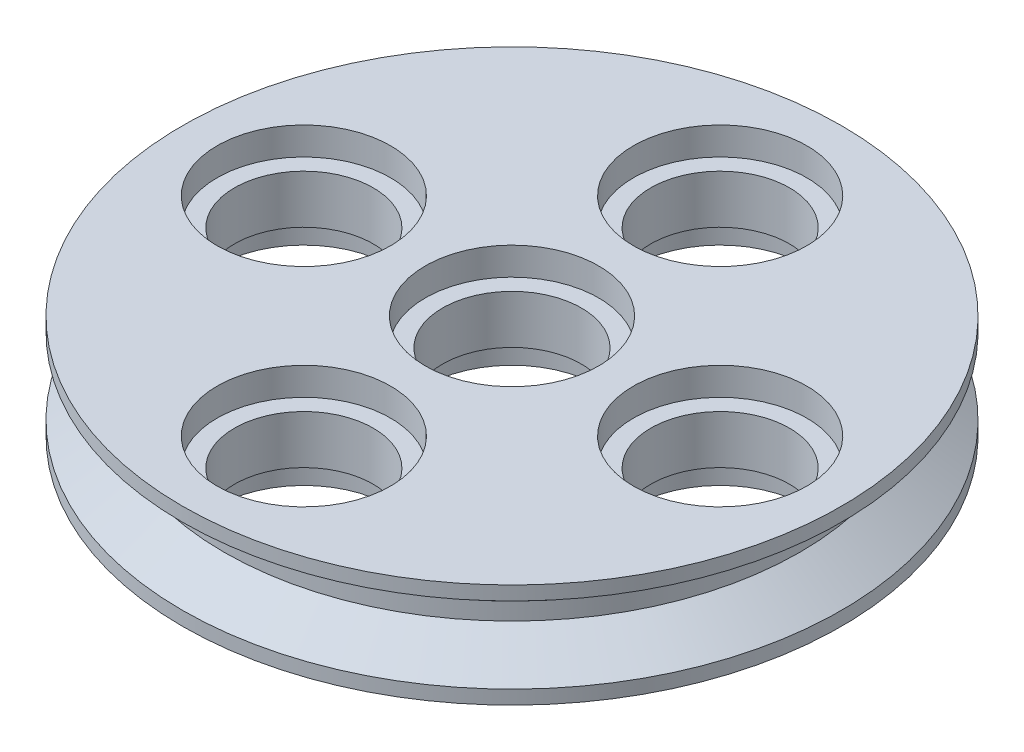
ISO-10303-21;
HEADER;
FILE_DESCRIPTION(('STEP AP214'),'2;1');
FILE_NAME('part.step','',(''),(''),'','','');
FILE_SCHEMA(('AUTOMOTIVE_DESIGN { 1 0 10303 214 1 1 1 1 }'));
ENDSEC;
DATA;
#1=APPLICATION_CONTEXT('core data for automotive mechanical design processes');
#2=APPLICATION_PROTOCOL_DEFINITION('international standard','automotive_design',2000,#1);
#3=PRODUCT_CONTEXT('',#1,'mechanical');
#4=PRODUCT('Part','Part','',(#3));
#5=PRODUCT_RELATED_PRODUCT_CATEGORY('part','',(#4));
#6=PRODUCT_DEFINITION_FORMATION('','',#4);
#7=PRODUCT_DEFINITION_CONTEXT('part definition',#1,'design');
#8=PRODUCT_DEFINITION('design','',#6,#7);
#9=PRODUCT_DEFINITION_SHAPE('','',#8);
#10=(LENGTH_UNIT() NAMED_UNIT(*) SI_UNIT(.MILLI.,.METRE.));
#11=(NAMED_UNIT(*) PLANE_ANGLE_UNIT() SI_UNIT($,.RADIAN.));
#12=(NAMED_UNIT(*) SI_UNIT($,.STERADIAN.) SOLID_ANGLE_UNIT());
#13=UNCERTAINTY_MEASURE_WITH_UNIT(LENGTH_MEASURE(1.E-05),#10,'distance_accuracy_value','');
#14=(GEOMETRIC_REPRESENTATION_CONTEXT(3) GLOBAL_UNCERTAINTY_ASSIGNED_CONTEXT((#13)) GLOBAL_UNIT_ASSIGNED_CONTEXT((#10,
#11,#12)) REPRESENTATION_CONTEXT('',''));
#15=CARTESIAN_POINT('',(0.,0.,0.));
#16=DIRECTION('',(0.,0.,1.));
#17=DIRECTION('',(1.,0.,0.));
#18=AXIS2_PLACEMENT_3D('',#15,#16,#17);
#19=CARTESIAN_POINT('',(0.,1.5,0.));
#20=DIRECTION('',(0.,-1.,0.));
#21=DIRECTION('',(0.,0.,-1.));
#22=AXIS2_PLACEMENT_3D('',#19,#20,#21);
#23=PLANE('',#22);
#24=CARTESIAN_POINT('',(0.,1.5,0.));
#25=DIRECTION('',(0.,1.,0.));
#26=DIRECTION('',(0.,0.,1.));
#27=AXIS2_PLACEMENT_3D('',#24,#25,#26);
#28=CIRCLE('',#27,2.5);
#29=CARTESIAN_POINT('',(0.,1.5,2.5));
#30=VERTEX_POINT('',#29);
#31=EDGE_CURVE('E91',#30,#30,#28,.T.);
#32=ORIENTED_EDGE('',*,*,#31,.F.);
#33=EDGE_LOOP('',(#32));
#34=FACE_BOUND('',#33,.T.);
#35=CARTESIAN_POINT('',(0.,1.5,-6.));
#36=DIRECTION('',(0.,1.,0.));
#37=DIRECTION('',(0.,0.,1.));
#38=AXIS2_PLACEMENT_3D('',#35,#36,#37);
#39=CIRCLE('',#38,2.5);
#40=CARTESIAN_POINT('',(0.,1.5,-3.5));
#41=VERTEX_POINT('',#40);
#42=EDGE_CURVE('E82',#41,#41,#39,.T.);
#43=ORIENTED_EDGE('',*,*,#42,.F.);
#44=EDGE_LOOP('',(#43));
#45=FACE_BOUND('',#44,.T.);
#46=CARTESIAN_POINT('',(-6.,1.5,0.));
#47=DIRECTION('',(0.,1.,0.));
#48=DIRECTION('',(0.,0.,1.));
#49=AXIS2_PLACEMENT_3D('',#46,#47,#48);
#50=CIRCLE('',#49,2.5);
#51=CARTESIAN_POINT('',(-6.,1.5,2.5));
#52=VERTEX_POINT('',#51);
#53=EDGE_CURVE('E73',#52,#52,#50,.T.);
#54=ORIENTED_EDGE('',*,*,#53,.F.);
#55=EDGE_LOOP('',(#54));
#56=FACE_BOUND('',#55,.T.);
#57=CARTESIAN_POINT('',(0.,1.5,6.));
#58=DIRECTION('',(0.,1.,0.));
#59=DIRECTION('',(0.,0.,1.));
#60=AXIS2_PLACEMENT_3D('',#57,#58,#59);
#61=CIRCLE('',#60,2.5);
#62=CARTESIAN_POINT('',(0.,1.5,8.5));
#63=VERTEX_POINT('',#62);
#64=EDGE_CURVE('E64',#63,#63,#61,.T.);
#65=ORIENTED_EDGE('',*,*,#64,.F.);
#66=EDGE_LOOP('',(#65));
#67=FACE_BOUND('',#66,.T.);
#68=CARTESIAN_POINT('',(6.,1.5,0.));
#69=DIRECTION('',(0.,1.,0.));
#70=DIRECTION('',(0.,0.,1.));
#71=AXIS2_PLACEMENT_3D('',#68,#69,#70);
#72=CIRCLE('',#71,2.5);
#73=CARTESIAN_POINT('',(6.,1.5,2.5));
#74=VERTEX_POINT('',#73);
#75=EDGE_CURVE('E55',#74,#74,#72,.T.);
#76=ORIENTED_EDGE('',*,*,#75,.F.);
#77=EDGE_LOOP('',(#76));
#78=FACE_BOUND('',#77,.T.);
#79=CARTESIAN_POINT('',(0.,1.5,0.));
#80=DIRECTION('',(0.,-1.,0.));
#81=DIRECTION('',(0.,0.,-1.));
#82=AXIS2_PLACEMENT_3D('',#79,#80,#81);
#83=CIRCLE('',#82,9.5);
#84=CARTESIAN_POINT('',(0.,1.5,-9.5));
#85=VERTEX_POINT('',#84);
#86=EDGE_CURVE('E10',#85,#85,#83,.T.);
#87=ORIENTED_EDGE('',*,*,#86,.F.);
#88=EDGE_LOOP('',(#87));
#89=FACE_BOUND('',#88,.T.);
#90=ADVANCED_FACE('F33',(#34,#45,#56,#67,#78,#89),#23,.F.);
#91=CARTESIAN_POINT('',(0.,0.,0.));
#92=DIRECTION('',(0.,-1.,0.));
#93=DIRECTION('',(0.,0.,-1.));
#94=AXIS2_PLACEMENT_3D('',#91,#92,#93);
#95=CYLINDRICAL_SURFACE('',#94,9.5);
#96=CARTESIAN_POINT('',(0.,1.1,0.));
#97=DIRECTION('',(0.,-1.,0.));
#98=DIRECTION('',(0.,0.,-1.));
#99=AXIS2_PLACEMENT_3D('',#96,#97,#98);
#100=CIRCLE('',#99,9.5);
#101=CARTESIAN_POINT('',(0.,1.1,-9.5));
#102=VERTEX_POINT('',#101);
#103=EDGE_CURVE('E39',#102,#102,#100,.T.);
#104=ORIENTED_EDGE('',*,*,#103,.F.);
#105=EDGE_LOOP('',(#104));
#106=FACE_BOUND('',#105,.T.);
#107=ORIENTED_EDGE('',*,*,#86,.T.);
#108=EDGE_LOOP('',(#107));
#109=FACE_BOUND('',#108,.T.);
#110=ADVANCED_FACE('F171',(#106,#109),#95,.T.);
#111=CARTESIAN_POINT('',(0.,1.1,0.));
#112=DIRECTION('',(0.,1.,0.));
#113=DIRECTION('',(0.,0.,1.));
#114=AXIS2_PLACEMENT_3D('',#111,#112,#113);
#115=CONICAL_SURFACE('',#114,9.5,0.95423717715527);
#116=CARTESIAN_POINT('',(0.,0.25,0.));
#117=DIRECTION('',(0.,-1.,0.));
#118=DIRECTION('',(0.,0.,-1.));
#119=AXIS2_PLACEMENT_3D('',#116,#117,#118);
#120=CIRCLE('',#119,8.3006668519548);
#121=CARTESIAN_POINT('',(0.,0.25,-8.3006668519548));
#122=VERTEX_POINT('',#121);
#123=EDGE_CURVE('E43',#122,#122,#120,.T.);
#124=ORIENTED_EDGE('',*,*,#123,.F.);
#125=EDGE_LOOP('',(#124));
#126=FACE_BOUND('',#125,.T.);
#127=ORIENTED_EDGE('',*,*,#103,.T.);
#128=EDGE_LOOP('',(#127));
#129=FACE_BOUND('',#128,.T.);
#130=ADVANCED_FACE('F176',(#126,#129),#115,.T.);
#131=CARTESIAN_POINT('',(0.,0.,0.));
#132=DIRECTION('',(0.,-1.,0.));
#133=DIRECTION('',(0.,0.,-1.));
#134=AXIS2_PLACEMENT_3D('',#131,#132,#133);
#135=CYLINDRICAL_SURFACE('',#134,8.3006668519548);
#136=ORIENTED_EDGE('',*,*,#123,.T.);
#137=EDGE_LOOP('',(#136));
#138=FACE_BOUND('',#137,.T.);
#139=CARTESIAN_POINT('',(0.,-0.25,0.));
#140=DIRECTION('',(0.,-1.,0.));
#141=DIRECTION('',(0.,0.,-1.));
#142=AXIS2_PLACEMENT_3D('',#139,#140,#141);
#143=CIRCLE('',#142,8.3006668519548);
#144=CARTESIAN_POINT('',(0.,-0.25,-8.3006668519548));
#145=VERTEX_POINT('',#144);
#146=EDGE_CURVE('E102',#145,#145,#143,.T.);
#147=ORIENTED_EDGE('',*,*,#146,.F.);
#148=EDGE_LOOP('',(#147));
#149=FACE_BOUND('',#148,.T.);
#150=ADVANCED_FACE('F210',(#138,#149),#135,.T.);
#151=CARTESIAN_POINT('',(6.,1.5,0.));
#152=DIRECTION('',(0.,1.,0.));
#153=DIRECTION('',(0.,0.,1.));
#154=AXIS2_PLACEMENT_3D('',#151,#152,#153);
#155=CYLINDRICAL_SURFACE('',#154,2.00000000000001);
#156=CARTESIAN_POINT('',(6.,0.700000000000004,0.));
#157=DIRECTION('',(0.,1.,0.));
#158=DIRECTION('',(0.,0.,1.));
#159=AXIS2_PLACEMENT_3D('',#156,#157,#158);
#160=CIRCLE('',#159,2.00000000000001);
#161=CARTESIAN_POINT('',(6.,0.700000000000004,2.00000000000001));
#162=VERTEX_POINT('',#161);
#163=EDGE_CURVE('E47',#162,#162,#160,.T.);
#164=ORIENTED_EDGE('',*,*,#163,.T.);
#165=EDGE_LOOP('',(#164));
#166=FACE_BOUND('',#165,.T.);
#167=CARTESIAN_POINT('',(6.,-0.700000000000004,0.));
#168=DIRECTION('',(0.,1.,0.));
#169=DIRECTION('',(0.,0.,1.));
#170=AXIS2_PLACEMENT_3D('',#167,#168,#169);
#171=CIRCLE('',#170,2.00000000000001);
#172=CARTESIAN_POINT('',(6.,-0.700000000000004,2.00000000000001));
#173=VERTEX_POINT('',#172);
#174=EDGE_CURVE('E106',#173,#173,#171,.T.);
#175=ORIENTED_EDGE('',*,*,#174,.F.);
#176=EDGE_LOOP('',(#175));
#177=FACE_BOUND('',#176,.T.);
#178=ADVANCED_FACE('F202',(#166,#177),#155,.F.);
#179=CARTESIAN_POINT('',(8.00000000000001,0.700000000000003,0.));
#180=DIRECTION('',(0.,-1.,0.));
#181=DIRECTION('',(0.,0.,-1.));
#182=AXIS2_PLACEMENT_3D('',#179,#180,#181);
#183=PLANE('',#182);
#184=ORIENTED_EDGE('',*,*,#163,.F.);
#185=EDGE_LOOP('',(#184));
#186=FACE_BOUND('',#185,.T.);
#187=CARTESIAN_POINT('',(6.,0.700000000000001,0.));
#188=DIRECTION('',(0.,1.,0.));
#189=DIRECTION('',(0.,0.,1.));
#190=AXIS2_PLACEMENT_3D('',#187,#188,#189);
#191=CIRCLE('',#190,2.5);
#192=CARTESIAN_POINT('',(6.,0.700000000000001,2.5));
#193=VERTEX_POINT('',#192);
#194=EDGE_CURVE('E52',#193,#193,#191,.T.);
#195=ORIENTED_EDGE('',*,*,#194,.T.);
#196=EDGE_LOOP('',(#195));
#197=FACE_BOUND('',#196,.T.);
#198=ADVANCED_FACE('F192',(#186,#197),#183,.F.);
#199=CARTESIAN_POINT('',(6.,1.5,0.));
#200=DIRECTION('',(0.,1.,0.));
#201=DIRECTION('',(0.,0.,1.));
#202=AXIS2_PLACEMENT_3D('',#199,#200,#201);
#203=CYLINDRICAL_SURFACE('',#202,2.5);
#204=ORIENTED_EDGE('',*,*,#194,.F.);
#205=EDGE_LOOP('',(#204));
#206=FACE_BOUND('',#205,.T.);
#207=ORIENTED_EDGE('',*,*,#75,.T.);
#208=EDGE_LOOP('',(#207));
#209=FACE_BOUND('',#208,.T.);
#210=ADVANCED_FACE('F189',(#206,#209),#203,.F.);
#211=CARTESIAN_POINT('',(0.,1.5,6.));
#212=DIRECTION('',(0.,1.,0.));
#213=DIRECTION('',(0.,0.,1.));
#214=AXIS2_PLACEMENT_3D('',#211,#212,#213);
#215=CYLINDRICAL_SURFACE('',#214,2.00000000000001);
#216=CARTESIAN_POINT('',(0.,0.700000000000004,6.));
#217=DIRECTION('',(0.,1.,0.));
#218=DIRECTION('',(0.,0.,1.));
#219=AXIS2_PLACEMENT_3D('',#216,#217,#218);
#220=CIRCLE('',#219,2.00000000000001);
#221=CARTESIAN_POINT('',(0.,0.700000000000004,8.00000000000001));
#222=VERTEX_POINT('',#221);
#223=EDGE_CURVE('E58',#222,#222,#220,.T.);
#224=ORIENTED_EDGE('',*,*,#223,.T.);
#225=EDGE_LOOP('',(#224));
#226=FACE_BOUND('',#225,.T.);
#227=CARTESIAN_POINT('',(0.,-0.700000000000004,6.));
#228=DIRECTION('',(0.,1.,0.));
#229=DIRECTION('',(0.,0.,1.));
#230=AXIS2_PLACEMENT_3D('',#227,#228,#229);
#231=CIRCLE('',#230,2.00000000000001);
#232=CARTESIAN_POINT('',(0.,-0.700000000000004,8.00000000000001));
#233=VERTEX_POINT('',#232);
#234=EDGE_CURVE('E118',#233,#233,#231,.T.);
#235=ORIENTED_EDGE('',*,*,#234,.F.);
#236=EDGE_LOOP('',(#235));
#237=FACE_BOUND('',#236,.T.);
#238=ADVANCED_FACE('F191',(#226,#237),#215,.F.);
#239=CARTESIAN_POINT('',(2.00000000000001,0.700000000000003,6.));
#240=DIRECTION('',(0.,-1.,0.));
#241=DIRECTION('',(0.,0.,-1.));
#242=AXIS2_PLACEMENT_3D('',#239,#240,#241);
#243=PLANE('',#242);
#244=ORIENTED_EDGE('',*,*,#223,.F.);
#245=EDGE_LOOP('',(#244));
#246=FACE_BOUND('',#245,.T.);
#247=CARTESIAN_POINT('',(0.,0.700000000000001,6.));
#248=DIRECTION('',(0.,1.,0.));
#249=DIRECTION('',(0.,0.,1.));
#250=AXIS2_PLACEMENT_3D('',#247,#248,#249);
#251=CIRCLE('',#250,2.5);
#252=CARTESIAN_POINT('',(0.,0.700000000000001,8.5));
#253=VERTEX_POINT('',#252);
#254=EDGE_CURVE('E61',#253,#253,#251,.T.);
#255=ORIENTED_EDGE('',*,*,#254,.T.);
#256=EDGE_LOOP('',(#255));
#257=FACE_BOUND('',#256,.T.);
#258=ADVANCED_FACE('F199',(#246,#257),#243,.F.);
#259=CARTESIAN_POINT('',(0.,1.5,6.));
#260=DIRECTION('',(0.,1.,0.));
#261=DIRECTION('',(0.,0.,1.));
#262=AXIS2_PLACEMENT_3D('',#259,#260,#261);
#263=CYLINDRICAL_SURFACE('',#262,2.5);
#264=ORIENTED_EDGE('',*,*,#254,.F.);
#265=EDGE_LOOP('',(#264));
#266=FACE_BOUND('',#265,.T.);
#267=ORIENTED_EDGE('',*,*,#64,.T.);
#268=EDGE_LOOP('',(#267));
#269=FACE_BOUND('',#268,.T.);
#270=ADVANCED_FACE('F276',(#266,#269),#263,.F.);
#271=CARTESIAN_POINT('',(-6.,1.5,0.));
#272=DIRECTION('',(0.,1.,0.));
#273=DIRECTION('',(0.,0.,1.));
#274=AXIS2_PLACEMENT_3D('',#271,#272,#273);
#275=CYLINDRICAL_SURFACE('',#274,2.00000000000001);
#276=CARTESIAN_POINT('',(-6.,0.700000000000004,0.));
#277=DIRECTION('',(0.,1.,0.));
#278=DIRECTION('',(0.,0.,1.));
#279=AXIS2_PLACEMENT_3D('',#276,#277,#278);
#280=CIRCLE('',#279,2.00000000000001);
#281=CARTESIAN_POINT('',(-6.,0.700000000000004,2.00000000000001));
#282=VERTEX_POINT('',#281);
#283=EDGE_CURVE('E67',#282,#282,#280,.T.);
#284=ORIENTED_EDGE('',*,*,#283,.T.);
#285=EDGE_LOOP('',(#284));
#286=FACE_BOUND('',#285,.T.);
#287=CARTESIAN_POINT('',(-6.,-0.700000000000004,0.));
#288=DIRECTION('',(0.,1.,0.));
#289=DIRECTION('',(0.,0.,1.));
#290=AXIS2_PLACEMENT_3D('',#287,#288,#289);
#291=CIRCLE('',#290,2.00000000000001);
#292=CARTESIAN_POINT('',(-6.,-0.700000000000004,2.00000000000001));
#293=VERTEX_POINT('',#292);
#294=EDGE_CURVE('E127',#293,#293,#291,.T.);
#295=ORIENTED_EDGE('',*,*,#294,.F.);
#296=EDGE_LOOP('',(#295));
#297=FACE_BOUND('',#296,.T.);
#298=ADVANCED_FACE('F272',(#286,#297),#275,.F.);
#299=CARTESIAN_POINT('',(-3.99999999999999,0.700000000000003,0.));
#300=DIRECTION('',(0.,-1.,0.));
#301=DIRECTION('',(0.,0.,-1.));
#302=AXIS2_PLACEMENT_3D('',#299,#300,#301);
#303=PLANE('',#302);
#304=ORIENTED_EDGE('',*,*,#283,.F.);
#305=EDGE_LOOP('',(#304));
#306=FACE_BOUND('',#305,.T.);
#307=CARTESIAN_POINT('',(-6.,0.700000000000001,0.));
#308=DIRECTION('',(0.,1.,0.));
#309=DIRECTION('',(0.,0.,1.));
#310=AXIS2_PLACEMENT_3D('',#307,#308,#309);
#311=CIRCLE('',#310,2.5);
#312=CARTESIAN_POINT('',(-6.,0.700000000000001,2.5));
#313=VERTEX_POINT('',#312);
#314=EDGE_CURVE('E70',#313,#313,#311,.T.);
#315=ORIENTED_EDGE('',*,*,#314,.T.);
#316=EDGE_LOOP('',(#315));
#317=FACE_BOUND('',#316,.T.);
#318=ADVANCED_FACE('F268',(#306,#317),#303,.F.);
#319=CARTESIAN_POINT('',(-6.,1.5,0.));
#320=DIRECTION('',(0.,1.,0.));
#321=DIRECTION('',(0.,0.,1.));
#322=AXIS2_PLACEMENT_3D('',#319,#320,#321);
#323=CYLINDRICAL_SURFACE('',#322,2.5);
#324=ORIENTED_EDGE('',*,*,#314,.F.);
#325=EDGE_LOOP('',(#324));
#326=FACE_BOUND('',#325,.T.);
#327=ORIENTED_EDGE('',*,*,#53,.T.);
#328=EDGE_LOOP('',(#327));
#329=FACE_BOUND('',#328,.T.);
#330=ADVANCED_FACE('F264',(#326,#329),#323,.F.);
#331=CARTESIAN_POINT('',(0.,1.5,-6.));
#332=DIRECTION('',(0.,1.,0.));
#333=DIRECTION('',(0.,0.,1.));
#334=AXIS2_PLACEMENT_3D('',#331,#332,#333);
#335=CYLINDRICAL_SURFACE('',#334,2.00000000000001);
#336=CARTESIAN_POINT('',(0.,0.700000000000004,-6.));
#337=DIRECTION('',(0.,1.,0.));
#338=DIRECTION('',(0.,0.,1.));
#339=AXIS2_PLACEMENT_3D('',#336,#337,#338);
#340=CIRCLE('',#339,2.00000000000001);
#341=CARTESIAN_POINT('',(0.,0.700000000000004,-3.99999999999999));
#342=VERTEX_POINT('',#341);
#343=EDGE_CURVE('E76',#342,#342,#340,.T.);
#344=ORIENTED_EDGE('',*,*,#343,.T.);
#345=EDGE_LOOP('',(#344));
#346=FACE_BOUND('',#345,.T.);
#347=CARTESIAN_POINT('',(0.,-0.700000000000004,-6.));
#348=DIRECTION('',(0.,1.,0.));
#349=DIRECTION('',(0.,0.,1.));
#350=AXIS2_PLACEMENT_3D('',#347,#348,#349);
#351=CIRCLE('',#350,2.00000000000001);
#352=CARTESIAN_POINT('',(0.,-0.700000000000004,-3.99999999999999));
#353=VERTEX_POINT('',#352);
#354=EDGE_CURVE('E136',#353,#353,#351,.T.);
#355=ORIENTED_EDGE('',*,*,#354,.F.);
#356=EDGE_LOOP('',(#355));
#357=FACE_BOUND('',#356,.T.);
#358=ADVANCED_FACE('F260',(#346,#357),#335,.F.);
#359=CARTESIAN_POINT('',(2.00000000000001,0.700000000000003,-6.));
#360=DIRECTION('',(0.,-1.,0.));
#361=DIRECTION('',(0.,0.,-1.));
#362=AXIS2_PLACEMENT_3D('',#359,#360,#361);
#363=PLANE('',#362);
#364=ORIENTED_EDGE('',*,*,#343,.F.);
#365=EDGE_LOOP('',(#364));
#366=FACE_BOUND('',#365,.T.);
#367=CARTESIAN_POINT('',(0.,0.700000000000001,-6.));
#368=DIRECTION('',(0.,1.,0.));
#369=DIRECTION('',(0.,0.,1.));
#370=AXIS2_PLACEMENT_3D('',#367,#368,#369);
#371=CIRCLE('',#370,2.5);
#372=CARTESIAN_POINT('',(0.,0.700000000000001,-3.5));
#373=VERTEX_POINT('',#372);
#374=EDGE_CURVE('E79',#373,#373,#371,.T.);
#375=ORIENTED_EDGE('',*,*,#374,.T.);
#376=EDGE_LOOP('',(#375));
#377=FACE_BOUND('',#376,.T.);
#378=ADVANCED_FACE('F256',(#366,#377),#363,.F.);
#379=CARTESIAN_POINT('',(0.,1.5,-6.));
#380=DIRECTION('',(0.,1.,0.));
#381=DIRECTION('',(0.,0.,1.));
#382=AXIS2_PLACEMENT_3D('',#379,#380,#381);
#383=CYLINDRICAL_SURFACE('',#382,2.5);
#384=ORIENTED_EDGE('',*,*,#374,.F.);
#385=EDGE_LOOP('',(#384));
#386=FACE_BOUND('',#385,.T.);
#387=ORIENTED_EDGE('',*,*,#42,.T.);
#388=EDGE_LOOP('',(#387));
#389=FACE_BOUND('',#388,.T.);
#390=ADVANCED_FACE('F252',(#386,#389),#383,.F.);
#391=CARTESIAN_POINT('',(0.,1.5,0.));
#392=DIRECTION('',(0.,1.,0.));
#393=DIRECTION('',(0.,0.,1.));
#394=AXIS2_PLACEMENT_3D('',#391,#392,#393);
#395=CYLINDRICAL_SURFACE('',#394,2.00000000000001);
#396=CARTESIAN_POINT('',(0.,0.700000000000004,0.));
#397=DIRECTION('',(0.,1.,0.));
#398=DIRECTION('',(0.,0.,1.));
#399=AXIS2_PLACEMENT_3D('',#396,#397,#398);
#400=CIRCLE('',#399,2.00000000000001);
#401=CARTESIAN_POINT('',(0.,0.700000000000004,2.00000000000001));
#402=VERTEX_POINT('',#401);
#403=EDGE_CURVE('E85',#402,#402,#400,.T.);
#404=ORIENTED_EDGE('',*,*,#403,.T.);
#405=EDGE_LOOP('',(#404));
#406=FACE_BOUND('',#405,.T.);
#407=CARTESIAN_POINT('',(0.,-0.700000000000004,0.));
#408=DIRECTION('',(0.,1.,0.));
#409=DIRECTION('',(0.,0.,1.));
#410=AXIS2_PLACEMENT_3D('',#407,#408,#409);
#411=CIRCLE('',#410,2.00000000000001);
#412=CARTESIAN_POINT('',(0.,-0.700000000000004,2.00000000000001));
#413=VERTEX_POINT('',#412);
#414=EDGE_CURVE('E146',#413,#413,#411,.T.);
#415=ORIENTED_EDGE('',*,*,#414,.F.);
#416=EDGE_LOOP('',(#415));
#417=FACE_BOUND('',#416,.T.);
#418=ADVANCED_FACE('F248',(#406,#417),#395,.F.);
#419=CARTESIAN_POINT('',(2.00000000000001,0.700000000000003,0.));
#420=DIRECTION('',(0.,-1.,0.));
#421=DIRECTION('',(0.,0.,-1.));
#422=AXIS2_PLACEMENT_3D('',#419,#420,#421);
#423=PLANE('',#422);
#424=ORIENTED_EDGE('',*,*,#403,.F.);
#425=EDGE_LOOP('',(#424));
#426=FACE_BOUND('',#425,.T.);
#427=CARTESIAN_POINT('',(0.,0.700000000000001,0.));
#428=DIRECTION('',(0.,1.,0.));
#429=DIRECTION('',(0.,0.,1.));
#430=AXIS2_PLACEMENT_3D('',#427,#428,#429);
#431=CIRCLE('',#430,2.5);
#432=CARTESIAN_POINT('',(0.,0.700000000000001,2.5));
#433=VERTEX_POINT('',#432);
#434=EDGE_CURVE('E88',#433,#433,#431,.T.);
#435=ORIENTED_EDGE('',*,*,#434,.T.);
#436=EDGE_LOOP('',(#435));
#437=FACE_BOUND('',#436,.T.);
#438=ADVANCED_FACE('F242',(#426,#437),#423,.F.);
#439=CARTESIAN_POINT('',(0.,1.5,0.));
#440=DIRECTION('',(0.,1.,0.));
#441=DIRECTION('',(0.,0.,1.));
#442=AXIS2_PLACEMENT_3D('',#439,#440,#441);
#443=CYLINDRICAL_SURFACE('',#442,2.5);
#444=ORIENTED_EDGE('',*,*,#434,.F.);
#445=EDGE_LOOP('',(#444));
#446=FACE_BOUND('',#445,.T.);
#447=ORIENTED_EDGE('',*,*,#31,.T.);
#448=EDGE_LOOP('',(#447));
#449=FACE_BOUND('',#448,.T.);
#450=ADVANCED_FACE('F237',(#446,#449),#443,.F.);
#451=CARTESIAN_POINT('',(0.,-1.5,0.));
#452=DIRECTION('',(0.,1.,0.));
#453=DIRECTION('',(0.,0.,-1.));
#454=AXIS2_PLACEMENT_3D('',#451,#452,#453);
#455=PLANE('',#454);
#456=CARTESIAN_POINT('',(0.,-1.5,0.));
#457=DIRECTION('',(0.,1.,0.));
#458=DIRECTION('',(0.,0.,1.));
#459=AXIS2_PLACEMENT_3D('',#456,#457,#458);
#460=CIRCLE('',#459,2.5);
#461=CARTESIAN_POINT('',(0.,-1.5,2.5));
#462=VERTEX_POINT('',#461);
#463=EDGE_CURVE('E152',#462,#462,#460,.T.);
#464=ORIENTED_EDGE('',*,*,#463,.T.);
#465=EDGE_LOOP('',(#464));
#466=FACE_BOUND('',#465,.T.);
#467=CARTESIAN_POINT('',(0.,-1.5,-6.));
#468=DIRECTION('',(0.,1.,0.));
#469=DIRECTION('',(0.,0.,1.));
#470=AXIS2_PLACEMENT_3D('',#467,#468,#469);
#471=CIRCLE('',#470,2.5);
#472=CARTESIAN_POINT('',(0.,-1.5,-3.5));
#473=VERTEX_POINT('',#472);
#474=EDGE_CURVE('E142',#473,#473,#471,.T.);
#475=ORIENTED_EDGE('',*,*,#474,.T.);
#476=EDGE_LOOP('',(#475));
#477=FACE_BOUND('',#476,.T.);
#478=CARTESIAN_POINT('',(-6.,-1.5,0.));
#479=DIRECTION('',(0.,1.,0.));
#480=DIRECTION('',(0.,0.,1.));
#481=AXIS2_PLACEMENT_3D('',#478,#479,#480);
#482=CIRCLE('',#481,2.5);
#483=CARTESIAN_POINT('',(-6.,-1.5,2.5));
#484=VERTEX_POINT('',#483);
#485=EDGE_CURVE('E133',#484,#484,#482,.T.);
#486=ORIENTED_EDGE('',*,*,#485,.T.);
#487=EDGE_LOOP('',(#486));
#488=FACE_BOUND('',#487,.T.);
#489=CARTESIAN_POINT('',(0.,-1.5,6.));
#490=DIRECTION('',(0.,1.,0.));
#491=DIRECTION('',(0.,0.,1.));
#492=AXIS2_PLACEMENT_3D('',#489,#490,#491);
#493=CIRCLE('',#492,2.5);
#494=CARTESIAN_POINT('',(0.,-1.5,8.5));
#495=VERTEX_POINT('',#494);
#496=EDGE_CURVE('E124',#495,#495,#493,.T.);
#497=ORIENTED_EDGE('',*,*,#496,.T.);
#498=EDGE_LOOP('',(#497));
#499=FACE_BOUND('',#498,.T.);
#500=CARTESIAN_POINT('',(6.,-1.5,0.));
#501=DIRECTION('',(0.,1.,0.));
#502=DIRECTION('',(0.,0.,1.));
#503=AXIS2_PLACEMENT_3D('',#500,#501,#502);
#504=CIRCLE('',#503,2.5);
#505=CARTESIAN_POINT('',(6.,-1.5,2.5));
#506=VERTEX_POINT('',#505);
#507=EDGE_CURVE('E114',#506,#506,#504,.T.);
#508=ORIENTED_EDGE('',*,*,#507,.T.);
#509=EDGE_LOOP('',(#508));
#510=FACE_BOUND('',#509,.T.);
#511=CARTESIAN_POINT('',(0.,-1.5,0.));
#512=DIRECTION('',(0.,-1.,0.));
#513=DIRECTION('',(0.,0.,-1.));
#514=AXIS2_PLACEMENT_3D('',#511,#512,#513);
#515=CIRCLE('',#514,9.5);
#516=CARTESIAN_POINT('',(0.,-1.5,-9.5));
#517=VERTEX_POINT('',#516);
#518=EDGE_CURVE('E94',#517,#517,#515,.T.);
#519=ORIENTED_EDGE('',*,*,#518,.T.);
#520=EDGE_LOOP('',(#519));
#521=FACE_BOUND('',#520,.T.);
#522=ADVANCED_FACE('F156',(#466,#477,#488,#499,#510,#521),#455,.F.);
#523=CARTESIAN_POINT('',(0.,0.,0.));
#524=DIRECTION('',(0.,1.,0.));
#525=DIRECTION('',(0.,0.,-1.));
#526=AXIS2_PLACEMENT_3D('',#523,#524,#525);
#527=CYLINDRICAL_SURFACE('',#526,9.5);
#528=CARTESIAN_POINT('',(0.,-1.1,0.));
#529=DIRECTION('',(0.,-1.,0.));
#530=DIRECTION('',(0.,0.,-1.));
#531=AXIS2_PLACEMENT_3D('',#528,#529,#530);
#532=CIRCLE('',#531,9.5);
#533=CARTESIAN_POINT('',(0.,-1.1,-9.5));
#534=VERTEX_POINT('',#533);
#535=EDGE_CURVE('E98',#534,#534,#532,.T.);
#536=ORIENTED_EDGE('',*,*,#535,.T.);
#537=EDGE_LOOP('',(#536));
#538=FACE_BOUND('',#537,.T.);
#539=ORIENTED_EDGE('',*,*,#518,.F.);
#540=EDGE_LOOP('',(#539));
#541=FACE_BOUND('',#540,.T.);
#542=ADVANCED_FACE('F227',(#538,#541),#527,.T.);
#543=CARTESIAN_POINT('',(0.,-1.1,0.));
#544=DIRECTION('',(0.,-1.,0.));
#545=DIRECTION('',(0.,0.,1.));
#546=AXIS2_PLACEMENT_3D('',#543,#544,#545);
#547=CONICAL_SURFACE('',#546,9.5,0.95423717715527);
#548=ORIENTED_EDGE('',*,*,#146,.T.);
#549=EDGE_LOOP('',(#548));
#550=FACE_BOUND('',#549,.T.);
#551=ORIENTED_EDGE('',*,*,#535,.F.);
#552=EDGE_LOOP('',(#551));
#553=FACE_BOUND('',#552,.T.);
#554=ADVANCED_FACE('F223',(#550,#553),#547,.T.);
#555=CARTESIAN_POINT('',(8.00000000000001,-0.700000000000003,0.));
#556=DIRECTION('',(0.,1.,0.));
#557=DIRECTION('',(0.,0.,-1.));
#558=AXIS2_PLACEMENT_3D('',#555,#556,#557);
#559=PLANE('',#558);
#560=ORIENTED_EDGE('',*,*,#174,.T.);
#561=EDGE_LOOP('',(#560));
#562=FACE_BOUND('',#561,.T.);
#563=CARTESIAN_POINT('',(6.,-0.700000000000001,0.));
#564=DIRECTION('',(0.,1.,0.));
#565=DIRECTION('',(0.,0.,1.));
#566=AXIS2_PLACEMENT_3D('',#563,#564,#565);
#567=CIRCLE('',#566,2.5);
#568=CARTESIAN_POINT('',(6.,-0.700000000000001,2.5));
#569=VERTEX_POINT('',#568);
#570=EDGE_CURVE('E110',#569,#569,#567,.T.);
#571=ORIENTED_EDGE('',*,*,#570,.F.);
#572=EDGE_LOOP('',(#571));
#573=FACE_BOUND('',#572,.T.);
#574=ADVANCED_FACE('F226',(#562,#573),#559,.F.);
#575=CARTESIAN_POINT('',(6.,-1.5,0.));
#576=DIRECTION('',(0.,-1.,0.));
#577=DIRECTION('',(0.,0.,1.));
#578=AXIS2_PLACEMENT_3D('',#575,#576,#577);
#579=CYLINDRICAL_SURFACE('',#578,2.5);
#580=ORIENTED_EDGE('',*,*,#570,.T.);
#581=EDGE_LOOP('',(#580));
#582=FACE_BOUND('',#581,.T.);
#583=ORIENTED_EDGE('',*,*,#507,.F.);
#584=EDGE_LOOP('',(#583));
#585=FACE_BOUND('',#584,.T.);
#586=ADVANCED_FACE('F295',(#582,#585),#579,.F.);
#587=CARTESIAN_POINT('',(2.00000000000001,-0.700000000000003,6.));
#588=DIRECTION('',(0.,1.,0.));
#589=DIRECTION('',(0.,0.,-1.));
#590=AXIS2_PLACEMENT_3D('',#587,#588,#589);
#591=PLANE('',#590);
#592=ORIENTED_EDGE('',*,*,#234,.T.);
#593=EDGE_LOOP('',(#592));
#594=FACE_BOUND('',#593,.T.);
#595=CARTESIAN_POINT('',(0.,-0.700000000000001,6.));
#596=DIRECTION('',(0.,1.,0.));
#597=DIRECTION('',(0.,0.,1.));
#598=AXIS2_PLACEMENT_3D('',#595,#596,#597);
#599=CIRCLE('',#598,2.5);
#600=CARTESIAN_POINT('',(0.,-0.700000000000001,8.5));
#601=VERTEX_POINT('',#600);
#602=EDGE_CURVE('E121',#601,#601,#599,.T.);
#603=ORIENTED_EDGE('',*,*,#602,.F.);
#604=EDGE_LOOP('',(#603));
#605=FACE_BOUND('',#604,.T.);
#606=ADVANCED_FACE('F291',(#594,#605),#591,.F.);
#607=CARTESIAN_POINT('',(0.,-1.5,6.));
#608=DIRECTION('',(0.,-1.,0.));
#609=DIRECTION('',(0.,0.,1.));
#610=AXIS2_PLACEMENT_3D('',#607,#608,#609);
#611=CYLINDRICAL_SURFACE('',#610,2.5);
#612=ORIENTED_EDGE('',*,*,#602,.T.);
#613=EDGE_LOOP('',(#612));
#614=FACE_BOUND('',#613,.T.);
#615=ORIENTED_EDGE('',*,*,#496,.F.);
#616=EDGE_LOOP('',(#615));
#617=FACE_BOUND('',#616,.T.);
#618=ADVANCED_FACE('F294',(#614,#617),#611,.F.);
#619=CARTESIAN_POINT('',(-3.99999999999999,-0.700000000000003,0.));
#620=DIRECTION('',(0.,1.,0.));
#621=DIRECTION('',(0.,0.,-1.));
#622=AXIS2_PLACEMENT_3D('',#619,#620,#621);
#623=PLANE('',#622);
#624=ORIENTED_EDGE('',*,*,#294,.T.);
#625=EDGE_LOOP('',(#624));
#626=FACE_BOUND('',#625,.T.);
#627=CARTESIAN_POINT('',(-6.,-0.700000000000001,0.));
#628=DIRECTION('',(0.,1.,0.));
#629=DIRECTION('',(0.,0.,1.));
#630=AXIS2_PLACEMENT_3D('',#627,#628,#629);
#631=CIRCLE('',#630,2.5);
#632=CARTESIAN_POINT('',(-6.,-0.700000000000001,2.5));
#633=VERTEX_POINT('',#632);
#634=EDGE_CURVE('E130',#633,#633,#631,.T.);
#635=ORIENTED_EDGE('',*,*,#634,.F.);
#636=EDGE_LOOP('',(#635));
#637=FACE_BOUND('',#636,.T.);
#638=ADVANCED_FACE('F301',(#626,#637),#623,.F.);
#639=CARTESIAN_POINT('',(-6.,-1.5,0.));
#640=DIRECTION('',(0.,-1.,0.));
#641=DIRECTION('',(0.,0.,1.));
#642=AXIS2_PLACEMENT_3D('',#639,#640,#641);
#643=CYLINDRICAL_SURFACE('',#642,2.5);
#644=ORIENTED_EDGE('',*,*,#634,.T.);
#645=EDGE_LOOP('',(#644));
#646=FACE_BOUND('',#645,.T.);
#647=ORIENTED_EDGE('',*,*,#485,.F.);
#648=EDGE_LOOP('',(#647));
#649=FACE_BOUND('',#648,.T.);
#650=ADVANCED_FACE('F319',(#646,#649),#643,.F.);
#651=CARTESIAN_POINT('',(2.00000000000001,-0.700000000000003,-6.));
#652=DIRECTION('',(0.,1.,0.));
#653=DIRECTION('',(0.,0.,-1.));
#654=AXIS2_PLACEMENT_3D('',#651,#652,#653);
#655=PLANE('',#654);
#656=ORIENTED_EDGE('',*,*,#354,.T.);
#657=EDGE_LOOP('',(#656));
#658=FACE_BOUND('',#657,.T.);
#659=CARTESIAN_POINT('',(0.,-0.700000000000001,-6.));
#660=DIRECTION('',(0.,1.,0.));
#661=DIRECTION('',(0.,0.,1.));
#662=AXIS2_PLACEMENT_3D('',#659,#660,#661);
#663=CIRCLE('',#662,2.5);
#664=CARTESIAN_POINT('',(0.,-0.700000000000001,-3.5));
#665=VERTEX_POINT('',#664);
#666=EDGE_CURVE('E139',#665,#665,#663,.T.);
#667=ORIENTED_EDGE('',*,*,#666,.F.);
#668=EDGE_LOOP('',(#667));
#669=FACE_BOUND('',#668,.T.);
#670=ADVANCED_FACE('F323',(#658,#669),#655,.F.);
#671=CARTESIAN_POINT('',(0.,-1.5,-6.));
#672=DIRECTION('',(0.,-1.,0.));
#673=DIRECTION('',(0.,0.,1.));
#674=AXIS2_PLACEMENT_3D('',#671,#672,#673);
#675=CYLINDRICAL_SURFACE('',#674,2.5);
#676=ORIENTED_EDGE('',*,*,#666,.T.);
#677=EDGE_LOOP('',(#676));
#678=FACE_BOUND('',#677,.T.);
#679=ORIENTED_EDGE('',*,*,#474,.F.);
#680=EDGE_LOOP('',(#679));
#681=FACE_BOUND('',#680,.T.);
#682=ADVANCED_FACE('F167',(#678,#681),#675,.F.);
#683=CARTESIAN_POINT('',(2.00000000000001,-0.700000000000003,0.));
#684=DIRECTION('',(0.,1.,0.));
#685=DIRECTION('',(0.,0.,-1.));
#686=AXIS2_PLACEMENT_3D('',#683,#684,#685);
#687=PLANE('',#686);
#688=ORIENTED_EDGE('',*,*,#414,.T.);
#689=EDGE_LOOP('',(#688));
#690=FACE_BOUND('',#689,.T.);
#691=CARTESIAN_POINT('',(0.,-0.700000000000001,0.));
#692=DIRECTION('',(0.,1.,0.));
#693=DIRECTION('',(0.,0.,1.));
#694=AXIS2_PLACEMENT_3D('',#691,#692,#693);
#695=CIRCLE('',#694,2.5);
#696=CARTESIAN_POINT('',(0.,-0.700000000000001,2.5));
#697=VERTEX_POINT('',#696);
#698=EDGE_CURVE('E149',#697,#697,#695,.T.);
#699=ORIENTED_EDGE('',*,*,#698,.F.);
#700=EDGE_LOOP('',(#699));
#701=FACE_BOUND('',#700,.T.);
#702=ADVANCED_FACE('F161',(#690,#701),#687,.F.);
#703=CARTESIAN_POINT('',(0.,-1.5,0.));
#704=DIRECTION('',(0.,-1.,0.));
#705=DIRECTION('',(0.,0.,1.));
#706=AXIS2_PLACEMENT_3D('',#703,#704,#705);
#707=CYLINDRICAL_SURFACE('',#706,2.5);
#708=ORIENTED_EDGE('',*,*,#698,.T.);
#709=EDGE_LOOP('',(#708));
#710=FACE_BOUND('',#709,.T.);
#711=ORIENTED_EDGE('',*,*,#463,.F.);
#712=EDGE_LOOP('',(#711));
#713=FACE_BOUND('',#712,.T.);
#714=ADVANCED_FACE('F159',(#710,#713),#707,.F.);
#715=CLOSED_SHELL('',(#90,#110,#130,#150,#178,#198,#210,#238,#258,#270,#298,#318,#330,#358,#378,
#390,#418,#438,#450,#522,#542,#554,#574,#586,#606,#618,#638,#650,#670,#682,#702,#714));
#716=MANIFOLD_SOLID_BREP('B2',#715);
#717=ADVANCED_BREP_SHAPE_REPRESENTATION('',(#18,#716),#14);
#718=SHAPE_DEFINITION_REPRESENTATION(#9,#717);
ENDSEC;
END-ISO-10303-21;
